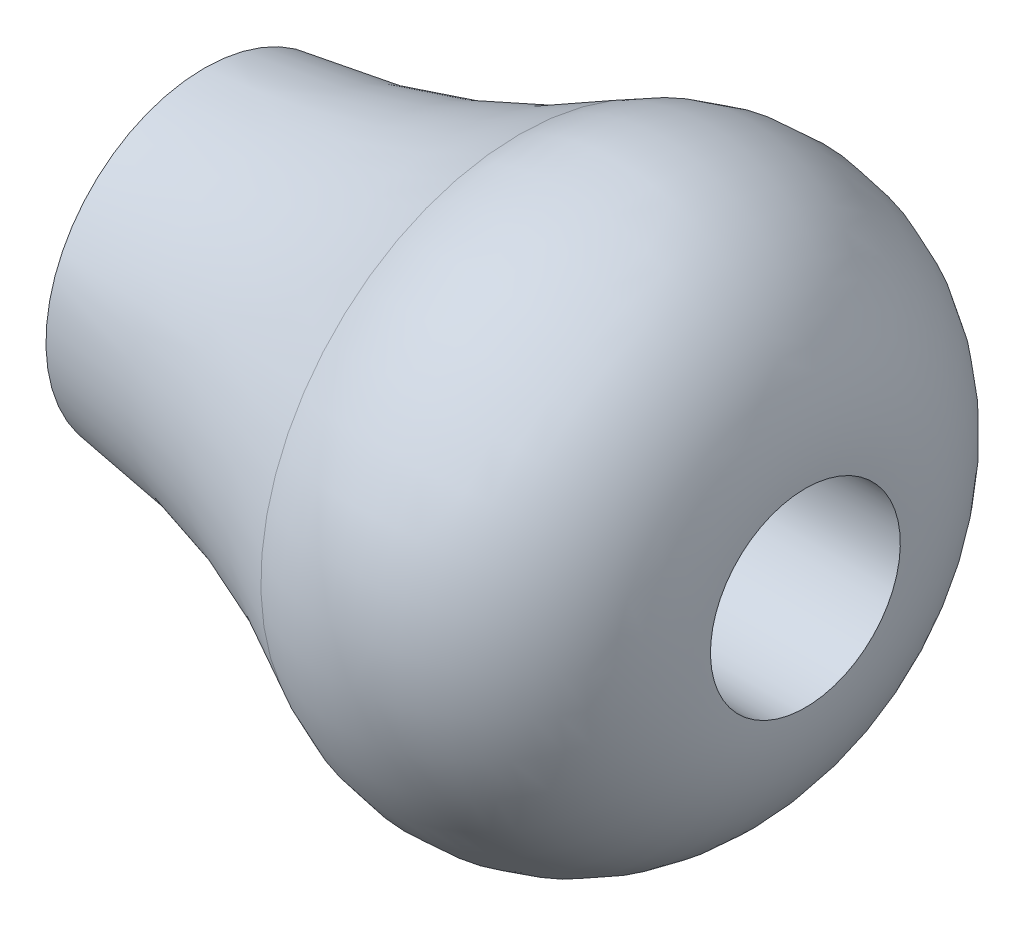
ISO-10303-21;
HEADER;
FILE_DESCRIPTION(('STEP AP214'),'2;1');
FILE_NAME('part.step','',(''),(''),'','','');
FILE_SCHEMA(('AUTOMOTIVE_DESIGN { 1 0 10303 214 1 1 1 1 }'));
ENDSEC;
DATA;
#1=APPLICATION_CONTEXT('core data for automotive mechanical design processes');
#2=APPLICATION_PROTOCOL_DEFINITION('international standard','automotive_design',2000,#1);
#3=PRODUCT_CONTEXT('',#1,'mechanical');
#4=PRODUCT('Part','Part','',(#3));
#5=PRODUCT_RELATED_PRODUCT_CATEGORY('part','',(#4));
#6=PRODUCT_DEFINITION_FORMATION('','',#4);
#7=PRODUCT_DEFINITION_CONTEXT('part definition',#1,'design');
#8=PRODUCT_DEFINITION('design','',#6,#7);
#9=PRODUCT_DEFINITION_SHAPE('','',#8);
#10=(LENGTH_UNIT() NAMED_UNIT(*) SI_UNIT(.MILLI.,.METRE.));
#11=(NAMED_UNIT(*) PLANE_ANGLE_UNIT() SI_UNIT($,.RADIAN.));
#12=(NAMED_UNIT(*) SI_UNIT($,.STERADIAN.) SOLID_ANGLE_UNIT());
#13=UNCERTAINTY_MEASURE_WITH_UNIT(LENGTH_MEASURE(1.E-05),#10,'distance_accuracy_value','');
#14=(GEOMETRIC_REPRESENTATION_CONTEXT(3) GLOBAL_UNCERTAINTY_ASSIGNED_CONTEXT((#13)) GLOBAL_UNIT_ASSIGNED_CONTEXT((#10,
#11,#12)) REPRESENTATION_CONTEXT('',''));
#15=CARTESIAN_POINT('',(0.,0.,0.));
#16=DIRECTION('',(0.,0.,1.));
#17=DIRECTION('',(1.,0.,0.));
#18=AXIS2_PLACEMENT_3D('',#15,#16,#17);
#19=CARTESIAN_POINT('',(0.,5.,0.));
#20=DIRECTION('',(-1.,0.,0.));
#21=DIRECTION('',(0.,-1.,0.));
#22=AXIS2_PLACEMENT_3D('',#19,#20,#21);
#23=PLANE('',#22);
#24=CARTESIAN_POINT('',(0.,0.,0.));
#25=DIRECTION('',(1.,0.,0.));
#26=DIRECTION('',(0.,1.,0.));
#27=AXIS2_PLACEMENT_3D('',#24,#25,#26);
#28=CIRCLE('',#27,1.75);
#29=CARTESIAN_POINT('',(0.,1.75,0.));
#30=VERTEX_POINT('',#29);
#31=EDGE_CURVE('E10',#30,#30,#28,.T.);
#32=ORIENTED_EDGE('',*,*,#31,.T.);
#33=EDGE_LOOP('',(#32));
#34=FACE_BOUND('',#33,.T.);
#35=CARTESIAN_POINT('',(0.,0.,0.));
#36=DIRECTION('',(1.,0.,0.));
#37=DIRECTION('',(0.,1.,0.));
#38=AXIS2_PLACEMENT_3D('',#35,#36,#37);
#39=CIRCLE('',#38,5.);
#40=CARTESIAN_POINT('',(0.,5.,0.));
#41=VERTEX_POINT('',#40);
#42=EDGE_CURVE('E61',#41,#41,#39,.T.);
#43=ORIENTED_EDGE('',*,*,#42,.F.);
#44=EDGE_LOOP('',(#43));
#45=FACE_BOUND('',#44,.T.);
#46=ADVANCED_FACE('F35',(#34,#45),#23,.T.);
#47=CARTESIAN_POINT('',(0.,0.,0.));
#48=DIRECTION('',(1.,0.,0.));
#49=DIRECTION('',(0.,1.,0.));
#50=AXIS2_PLACEMENT_3D('',#47,#48,#49);
#51=CYLINDRICAL_SURFACE('',#50,1.75);
#52=CARTESIAN_POINT('',(5.,0.,0.));
#53=DIRECTION('',(1.,0.,0.));
#54=DIRECTION('',(0.,1.,0.));
#55=AXIS2_PLACEMENT_3D('',#52,#53,#54);
#56=CIRCLE('',#55,1.75);
#57=CARTESIAN_POINT('',(5.,1.75,0.));
#58=VERTEX_POINT('',#57);
#59=EDGE_CURVE('E41',#58,#58,#56,.T.);
#60=ORIENTED_EDGE('',*,*,#59,.T.);
#61=EDGE_LOOP('',(#60));
#62=FACE_BOUND('',#61,.T.);
#63=ORIENTED_EDGE('',*,*,#31,.F.);
#64=EDGE_LOOP('',(#63));
#65=FACE_BOUND('',#64,.T.);
#66=ADVANCED_FACE('F69',(#62,#65),#51,.F.);
#67=CARTESIAN_POINT('',(5.,1.75,0.));
#68=DIRECTION('',(1.,0.,0.));
#69=DIRECTION('',(0.,1.,0.));
#70=AXIS2_PLACEMENT_3D('',#67,#68,#69);
#71=PLANE('',#70);
#72=CARTESIAN_POINT('',(5.,0.,0.));
#73=DIRECTION('',(1.,0.,0.));
#74=DIRECTION('',(0.,1.,0.));
#75=AXIS2_PLACEMENT_3D('',#72,#73,#74);
#76=CIRCLE('',#75,3.);
#77=CARTESIAN_POINT('',(5.,3.,0.));
#78=VERTEX_POINT('',#77);
#79=EDGE_CURVE('E46',#78,#78,#76,.T.);
#80=ORIENTED_EDGE('',*,*,#79,.T.);
#81=EDGE_LOOP('',(#80));
#82=FACE_BOUND('',#81,.T.);
#83=ORIENTED_EDGE('',*,*,#59,.F.);
#84=EDGE_LOOP('',(#83));
#85=FACE_BOUND('',#84,.T.);
#86=ADVANCED_FACE('F73',(#82,#85),#71,.T.);
#87=CARTESIAN_POINT('',(0.,0.,0.));
#88=DIRECTION('',(1.,0.,0.));
#89=DIRECTION('',(0.,1.,0.));
#90=AXIS2_PLACEMENT_3D('',#87,#88,#89);
#91=CYLINDRICAL_SURFACE('',#90,3.);
#92=CARTESIAN_POINT('',(19.,0.,0.));
#93=DIRECTION('',(1.,0.,0.));
#94=DIRECTION('',(0.,1.,0.));
#95=AXIS2_PLACEMENT_3D('',#92,#93,#94);
#96=CIRCLE('',#95,3.);
#97=CARTESIAN_POINT('',(19.,3.,0.));
#98=VERTEX_POINT('',#97);
#99=EDGE_CURVE('E51',#98,#98,#96,.T.);
#100=ORIENTED_EDGE('',*,*,#99,.T.);
#101=EDGE_LOOP('',(#100));
#102=FACE_BOUND('',#101,.T.);
#103=ORIENTED_EDGE('',*,*,#79,.F.);
#104=EDGE_LOOP('',(#103));
#105=FACE_BOUND('',#104,.T.);
#106=ADVANCED_FACE('F77',(#102,#105),#91,.F.);
#107=CARTESIAN_POINT('',(13.,0.,0.));
#108=DIRECTION('',(1.,0.,0.));
#109=DIRECTION('',(0.,1.,0.));
#110=AXIS2_PLACEMENT_3D('',#107,#108,#109);
#111=DEGENERATE_TOROIDAL_SURFACE('',#110,3.,6.,.T.);
#112=CARTESIAN_POINT('',(9.96739069193258,0.,0.));
#113=DIRECTION('',(1.,0.,0.));
#114=DIRECTION('',(0.,1.,0.));
#115=AXIS2_PLACEMENT_3D('',#112,#113,#114);
#116=CIRCLE('',#115,8.1771885019403);
#117=CARTESIAN_POINT('',(9.96739069193258,8.1771885019403,0.));
#118=VERTEX_POINT('',#117);
#119=EDGE_CURVE('E57',#118,#118,#116,.T.);
#120=ORIENTED_EDGE('',*,*,#119,.T.);
#121=EDGE_LOOP('',(#120));
#122=FACE_BOUND('',#121,.T.);
#123=ORIENTED_EDGE('',*,*,#99,.F.);
#124=EDGE_LOOP('',(#123));
#125=FACE_BOUND('',#124,.T.);
#126=ADVANCED_FACE('F84',(#122,#125),#111,.T.);
#127=CARTESIAN_POINT('',(-2.07687941359589,0.,0.));
#128=DIRECTION('',(1.,0.,0.));
#129=DIRECTION('',(0.,1.,0.));
#130=AXIS2_PLACEMENT_3D('',#127,#128,#129);
#131=TOROIDAL_SURFACE('',#130,28.7388403239293,23.8295188374342);
#132=ORIENTED_EDGE('',*,*,#42,.T.);
#133=EDGE_LOOP('',(#132));
#134=FACE_BOUND('',#133,.T.);
#135=ORIENTED_EDGE('',*,*,#119,.F.);
#136=EDGE_LOOP('',(#135));
#137=FACE_BOUND('',#136,.T.);
#138=ADVANCED_FACE('F65',(#134,#137),#131,.F.);
#139=CLOSED_SHELL('',(#46,#66,#86,#106,#126,#138));
#140=MANIFOLD_SOLID_BREP('B2',#139);
#141=ADVANCED_BREP_SHAPE_REPRESENTATION('',(#18,#140),#14);
#142=SHAPE_DEFINITION_REPRESENTATION(#9,#141);
ENDSEC;
END-ISO-10303-21;
